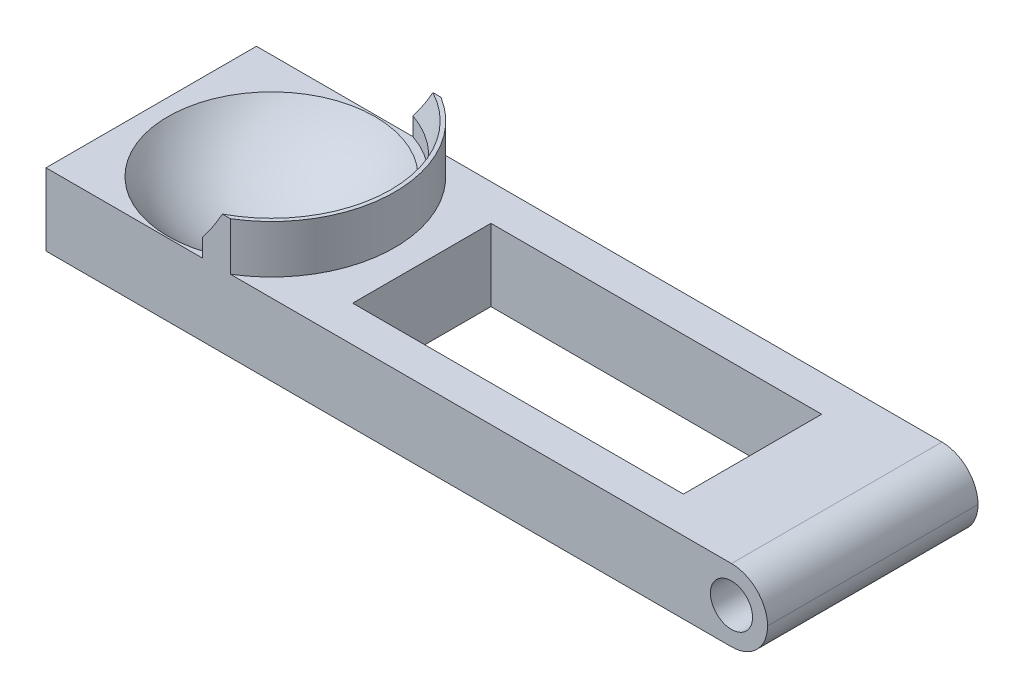
ISO-10303-21;
HEADER;
FILE_DESCRIPTION(('STEP AP214'),'2;1');
FILE_NAME('part.step','',(''),(''),'','','');
FILE_SCHEMA(('AUTOMOTIVE_DESIGN { 1 0 10303 214 1 1 1 1 }'));
ENDSEC;
DATA;
#1=APPLICATION_CONTEXT('core data for automotive mechanical design processes');
#2=APPLICATION_PROTOCOL_DEFINITION('international standard','automotive_design',2000,#1);
#3=PRODUCT_CONTEXT('',#1,'mechanical');
#4=PRODUCT('Part','Part','',(#3));
#5=PRODUCT_RELATED_PRODUCT_CATEGORY('part','',(#4));
#6=PRODUCT_DEFINITION_FORMATION('','',#4);
#7=PRODUCT_DEFINITION_CONTEXT('part definition',#1,'design');
#8=PRODUCT_DEFINITION('design','',#6,#7);
#9=PRODUCT_DEFINITION_SHAPE('','',#8);
#10=(LENGTH_UNIT() NAMED_UNIT(*) SI_UNIT(.MILLI.,.METRE.));
#11=(NAMED_UNIT(*) PLANE_ANGLE_UNIT() SI_UNIT($,.RADIAN.));
#12=(NAMED_UNIT(*) SI_UNIT($,.STERADIAN.) SOLID_ANGLE_UNIT());
#13=UNCERTAINTY_MEASURE_WITH_UNIT(LENGTH_MEASURE(1.E-05),#10,'distance_accuracy_value','');
#14=(GEOMETRIC_REPRESENTATION_CONTEXT(3) GLOBAL_UNCERTAINTY_ASSIGNED_CONTEXT((#13)) GLOBAL_UNIT_ASSIGNED_CONTEXT((#10,
#11,#12)) REPRESENTATION_CONTEXT('',''));
#15=CARTESIAN_POINT('',(0.,0.,0.));
#16=DIRECTION('',(0.,0.,1.));
#17=DIRECTION('',(1.,0.,0.));
#18=AXIS2_PLACEMENT_3D('',#15,#16,#17);
#19=CARTESIAN_POINT('',(0.,6.,0.));
#20=DIRECTION('',(0.,1.,0.));
#21=DIRECTION('',(0.,0.,1.));
#22=AXIS2_PLACEMENT_3D('',#19,#20,#21);
#23=PLANE('',#22);
#24=CARTESIAN_POINT('',(-40.,6.,0.));
#25=DIRECTION('',(0.,1.,0.));
#26=DIRECTION('',(0.,0.,1.));
#27=AXIS2_PLACEMENT_3D('',#24,#25,#26);
#28=CIRCLE('',#27,17.2336879396141);
#29=CARTESIAN_POINT('',(-40.,6.,17.2336879396141));
#30=VERTEX_POINT('',#29);
#31=EDGE_CURVE('E261',#30,#30,#28,.F.);
#32=ORIENTED_EDGE('',*,*,#31,.T.);
#33=EDGE_LOOP('',(#32));
#34=FACE_BOUND('',#33,.T.);
#35=DIRECTION('',(1.,0.,0.));
#36=VECTOR('',#35,1.);
#37=CARTESIAN_POINT('',(-60.,6.,17.5));
#38=LINE('',#37,#36);
#39=CARTESIAN_POINT('',(-60.,6.,17.5));
#40=VERTEX_POINT('',#39);
#41=CARTESIAN_POINT('',(-34.,6.,17.5));
#42=VERTEX_POINT('',#41);
#43=EDGE_CURVE('E269',#40,#42,#38,.T.);
#44=ORIENTED_EDGE('',*,*,#43,.T.);
#45=CARTESIAN_POINT('',(-40.,6.,0.));
#46=DIRECTION('',(0.,-1.,0.));
#47=DIRECTION('',(0.,0.,1.));
#48=AXIS2_PLACEMENT_3D('',#45,#46,#47);
#49=CIRCLE('',#48,18.5);
#50=CARTESIAN_POINT('',(-34.,6.,-17.5));
#51=VERTEX_POINT('',#50);
#52=EDGE_CURVE('E181',#51,#42,#49,.T.);
#53=ORIENTED_EDGE('',*,*,#52,.F.);
#54=DIRECTION('',(-1.,0.,0.));
#55=VECTOR('',#54,1.);
#56=CARTESIAN_POINT('',(-60.,6.,-17.5));
#57=LINE('',#56,#55);
#58=CARTESIAN_POINT('',(-60.,6.,-17.5));
#59=VERTEX_POINT('',#58);
#60=EDGE_CURVE('E266',#51,#59,#57,.T.);
#61=ORIENTED_EDGE('',*,*,#60,.T.);
#62=DIRECTION('',(0.,0.,1.));
#63=VECTOR('',#62,1.);
#64=CARTESIAN_POINT('',(-60.,6.,-17.5));
#65=LINE('',#64,#63);
#66=EDGE_CURVE('E265',#59,#40,#65,.T.);
#67=ORIENTED_EDGE('',*,*,#66,.T.);
#68=EDGE_LOOP('',(#44,#53,#61,#67));
#69=FACE_BOUND('',#68,.T.);
#70=ADVANCED_FACE('F41',(#34,#69),#23,.T.);
#71=DIRECTION('',(0.,0.,1.));
#72=VECTOR('',#71,1.);
#73=CARTESIAN_POINT('',(-15.,6.,-11.5));
#74=LINE('',#73,#72);
#75=CARTESIAN_POINT('',(-15.,6.,-11.5));
#76=VERTEX_POINT('',#75);
#77=CARTESIAN_POINT('',(-15.,6.,11.5));
#78=VERTEX_POINT('',#77);
#79=EDGE_CURVE('E193',#76,#78,#74,.T.);
#80=ORIENTED_EDGE('',*,*,#79,.F.);
#81=DIRECTION('',(-1.,0.,0.));
#82=VECTOR('',#81,1.);
#83=CARTESIAN_POINT('',(-15.,6.,-11.5));
#84=LINE('',#83,#82);
#85=CARTESIAN_POINT('',(40.,6.,-11.5));
#86=VERTEX_POINT('',#85);
#87=EDGE_CURVE('E199',#86,#76,#84,.T.);
#88=ORIENTED_EDGE('',*,*,#87,.F.);
#89=DIRECTION('',(0.,0.,-1.));
#90=VECTOR('',#89,1.);
#91=CARTESIAN_POINT('',(40.,6.,-11.5));
#92=LINE('',#91,#90);
#93=CARTESIAN_POINT('',(40.,6.,11.5));
#94=VERTEX_POINT('',#93);
#95=EDGE_CURVE('E218',#94,#86,#92,.T.);
#96=ORIENTED_EDGE('',*,*,#95,.F.);
#97=DIRECTION('',(1.,0.,0.));
#98=VECTOR('',#97,1.);
#99=CARTESIAN_POINT('',(-15.,6.,11.5));
#100=LINE('',#99,#98);
#101=EDGE_CURVE('E214',#78,#94,#100,.T.);
#102=ORIENTED_EDGE('',*,*,#101,.F.);
#103=EDGE_LOOP('',(#80,#88,#96,#102));
#104=FACE_BOUND('',#103,.T.);
#105=CARTESIAN_POINT('',(54.,6.,-17.5));
#106=VERTEX_POINT('',#105);
#107=CARTESIAN_POINT('',(-29.3229217479687,6.,-17.5));
#108=VERTEX_POINT('',#107);
#109=EDGE_CURVE('E262',#106,#108,#57,.T.);
#110=ORIENTED_EDGE('',*,*,#109,.T.);
#111=CARTESIAN_POINT('',(-40.,6.,0.));
#112=DIRECTION('',(0.,1.,0.));
#113=DIRECTION('',(0.,0.,1.));
#114=AXIS2_PLACEMENT_3D('',#111,#112,#113);
#115=CIRCLE('',#114,20.5);
#116=CARTESIAN_POINT('',(-29.3229217479687,6.,17.5));
#117=VERTEX_POINT('',#116);
#118=EDGE_CURVE('E157',#117,#108,#115,.T.);
#119=ORIENTED_EDGE('',*,*,#118,.F.);
#120=CARTESIAN_POINT('',(54.,6.,17.5));
#121=VERTEX_POINT('',#120);
#122=EDGE_CURVE('E164',#117,#121,#38,.T.);
#123=ORIENTED_EDGE('',*,*,#122,.T.);
#124=DIRECTION('',(0.,0.,-1.));
#125=VECTOR('',#124,1.);
#126=CARTESIAN_POINT('',(54.,6.,-17.5));
#127=LINE('',#126,#125);
#128=EDGE_CURVE('E292',#121,#106,#127,.T.);
#129=ORIENTED_EDGE('',*,*,#128,.T.);
#130=EDGE_LOOP('',(#110,#119,#123,#129));
#131=FACE_BOUND('',#130,.T.);
#132=ADVANCED_FACE('F339',(#104,#131),#23,.T.);
#133=CARTESIAN_POINT('',(-60.,6.,-17.5));
#134=DIRECTION('',(0.,0.,1.));
#135=DIRECTION('',(1.,0.,0.));
#136=AXIS2_PLACEMENT_3D('',#133,#134,#135);
#137=PLANE('',#136);
#138=CARTESIAN_POINT('',(54.,0.,-17.5));
#139=DIRECTION('',(0.,0.,1.));
#140=DIRECTION('',(1.,0.,0.));
#141=AXIS2_PLACEMENT_3D('',#138,#139,#140);
#142=CIRCLE('',#141,3.49999999999999);
#143=CARTESIAN_POINT('',(57.5,0.,-17.5));
#144=VERTEX_POINT('',#143);
#145=EDGE_CURVE('E257',#144,#144,#142,.T.);
#146=ORIENTED_EDGE('',*,*,#145,.T.);
#147=EDGE_LOOP('',(#146));
#148=FACE_BOUND('',#147,.T.);
#149=DIRECTION('',(0.,-1.,0.));
#150=VECTOR('',#149,1.);
#151=CARTESIAN_POINT('',(-34.,14.,-17.5));
#152=LINE('',#151,#150);
#153=CARTESIAN_POINT('',(-34.,8.9999999999998,-17.5));
#154=VERTEX_POINT('',#153);
#155=EDGE_CURVE('E178',#154,#51,#152,.T.);
#156=ORIENTED_EDGE('',*,*,#155,.F.);
#157=CARTESIAN_POINT('',(-34.,8.9999999999998,-17.5));
#158=CARTESIAN_POINT('',(-33.839945813921,9.19379162147937,-17.5));
#159=CARTESIAN_POINT('',(-33.6832597545491,9.39031813066395,-17.5));
#160=CARTESIAN_POINT('',(-33.375965891554,9.78799904200103,-17.5));
#161=CARTESIAN_POINT('',(-33.2253566520652,9.98915233306445,-17.5));
#162=CARTESIAN_POINT('',(-32.9297425304379,10.3949815209771,-17.5));
#163=CARTESIAN_POINT('',(-32.7847282801367,10.5996506190985,-17.5));
#164=CARTESIAN_POINT('',(-32.4994602314663,11.0122906147006,-17.5));
#165=CARTESIAN_POINT('',(-32.3592067428698,11.2202617257487,-17.5));
#166=CARTESIAN_POINT('',(-31.9449508238071,11.8482158349723,-17.5));
#167=CARTESIAN_POINT('',(-31.6773247984188,12.2724176608303,-17.5));
#168=CARTESIAN_POINT('',(-31.286102984043,12.9153929206351,-17.5));
#169=CARTESIAN_POINT('',(-31.1572850971386,13.1310310144792,-17.5));
#170=CARTESIAN_POINT('',(-30.9028469630048,13.5641710952025,-17.5));
#171=CARTESIAN_POINT('',(-30.7772265452698,13.7816729818645,-17.5));
#172=CARTESIAN_POINT('',(-30.6530475638917,14.,-17.5));
#173=B_SPLINE_CURVE_WITH_KNOTS('',3,(#157,#158,#159,#160,#161,#162,#163,#164,#165,#166,#167,
#168,#169,#170,#171,#172),.UNSPECIFIED.,.F.,.F.,(4,2,2,2,2,2,2,4),(0.,0.753934324298083,
1.50768944879851,2.26012226827586,3.01260395345633,4.51690974592432,5.27044665794318,
6.02394330294391),.UNSPECIFIED.);
#174=CARTESIAN_POINT('',(-30.6530475638917,14.,-17.5));
#175=VERTEX_POINT('',#174);
#176=EDGE_CURVE('E11',#154,#175,#173,.T.);
#177=ORIENTED_EDGE('',*,*,#176,.T.);
#178=DIRECTION('',(-1.,0.,0.));
#179=VECTOR('',#178,1.);
#180=CARTESIAN_POINT('',(-34.,14.,-17.5));
#181=LINE('',#180,#179);
#182=CARTESIAN_POINT('',(-29.3229217479687,14.,-17.5));
#183=VERTEX_POINT('',#182);
#184=EDGE_CURVE('E175',#183,#175,#181,.T.);
#185=ORIENTED_EDGE('',*,*,#184,.F.);
#186=DIRECTION('',(0.,-1.,0.));
#187=VECTOR('',#186,1.);
#188=CARTESIAN_POINT('',(-29.3229217479687,14.,-17.5));
#189=LINE('',#188,#187);
#190=EDGE_CURVE('E169',#183,#108,#189,.T.);
#191=ORIENTED_EDGE('',*,*,#190,.T.);
#192=ORIENTED_EDGE('',*,*,#109,.F.);
#193=CARTESIAN_POINT('',(54.,0.,-17.5));
#194=DIRECTION('',(0.,0.,1.));
#195=DIRECTION('',(1.,0.,0.));
#196=AXIS2_PLACEMENT_3D('',#193,#194,#195);
#197=CIRCLE('',#196,6.);
#198=CARTESIAN_POINT('',(60.,0.,-17.5));
#199=VERTEX_POINT('',#198);
#200=EDGE_CURVE('E299',#106,#199,#197,.F.);
#201=ORIENTED_EDGE('',*,*,#200,.T.);
#202=CARTESIAN_POINT('',(54.,0.,-17.5));
#203=DIRECTION('',(0.,0.,1.));
#204=DIRECTION('',(1.,0.,0.));
#205=AXIS2_PLACEMENT_3D('',#202,#203,#204);
#206=CIRCLE('',#205,6.);
#207=CARTESIAN_POINT('',(54.,-6.,-17.5));
#208=VERTEX_POINT('',#207);
#209=EDGE_CURVE('E296',#199,#208,#206,.F.);
#210=ORIENTED_EDGE('',*,*,#209,.T.);
#211=DIRECTION('',(-1.,0.,0.));
#212=VECTOR('',#211,1.);
#213=CARTESIAN_POINT('',(-60.,-6.,-17.5));
#214=LINE('',#213,#212);
#215=CARTESIAN_POINT('',(-60.,-6.,-17.5));
#216=VERTEX_POINT('',#215);
#217=EDGE_CURVE('E274',#208,#216,#214,.T.);
#218=ORIENTED_EDGE('',*,*,#217,.T.);
#219=DIRECTION('',(0.,-1.,0.));
#220=VECTOR('',#219,1.);
#221=CARTESIAN_POINT('',(-60.,6.,-17.5));
#222=LINE('',#221,#220);
#223=EDGE_CURVE('E288',#59,#216,#222,.T.);
#224=ORIENTED_EDGE('',*,*,#223,.F.);
#225=ORIENTED_EDGE('',*,*,#60,.F.);
#226=EDGE_LOOP('',(#156,#177,#185,#191,#192,#201,#210,#218,#224,#225));
#227=FACE_BOUND('',#226,.T.);
#228=ADVANCED_FACE('F334',(#148,#227),#137,.F.);
#229=CARTESIAN_POINT('',(-60.,6.,-17.5));
#230=DIRECTION('',(1.,0.,0.));
#231=DIRECTION('',(0.,0.,-1.));
#232=AXIS2_PLACEMENT_3D('',#229,#230,#231);
#233=PLANE('',#232);
#234=DIRECTION('',(0.,0.,1.));
#235=VECTOR('',#234,1.);
#236=CARTESIAN_POINT('',(-60.,-6.,-17.5));
#237=LINE('',#236,#235);
#238=CARTESIAN_POINT('',(-60.,-6.,17.5));
#239=VERTEX_POINT('',#238);
#240=EDGE_CURVE('E277',#216,#239,#237,.T.);
#241=ORIENTED_EDGE('',*,*,#240,.T.);
#242=DIRECTION('',(0.,-1.,0.));
#243=VECTOR('',#242,1.);
#244=CARTESIAN_POINT('',(-60.,6.,17.5));
#245=LINE('',#244,#243);
#246=EDGE_CURVE('E273',#40,#239,#245,.T.);
#247=ORIENTED_EDGE('',*,*,#246,.F.);
#248=ORIENTED_EDGE('',*,*,#66,.F.);
#249=ORIENTED_EDGE('',*,*,#223,.T.);
#250=EDGE_LOOP('',(#241,#247,#248,#249));
#251=FACE_BOUND('',#250,.T.);
#252=ADVANCED_FACE('F330',(#251),#233,.F.);
#253=CARTESIAN_POINT('',(-60.,6.,17.5));
#254=DIRECTION('',(0.,0.,-1.));
#255=DIRECTION('',(-1.,0.,0.));
#256=AXIS2_PLACEMENT_3D('',#253,#254,#255);
#257=PLANE('',#256);
#258=CARTESIAN_POINT('',(54.,0.,17.5));
#259=DIRECTION('',(0.,0.,1.));
#260=DIRECTION('',(1.,0.,0.));
#261=AXIS2_PLACEMENT_3D('',#258,#259,#260);
#262=CIRCLE('',#261,3.5);
#263=CARTESIAN_POINT('',(57.5,0.,17.5));
#264=VERTEX_POINT('',#263);
#265=EDGE_CURVE('E242',#264,#264,#262,.T.);
#266=ORIENTED_EDGE('',*,*,#265,.F.);
#267=EDGE_LOOP('',(#266));
#268=FACE_BOUND('',#267,.T.);
#269=DIRECTION('',(1.,0.,0.));
#270=VECTOR('',#269,1.);
#271=CARTESIAN_POINT('',(-34.,14.,17.5));
#272=LINE('',#271,#270);
#273=CARTESIAN_POINT('',(-30.6530475638917,14.,17.5));
#274=VERTEX_POINT('',#273);
#275=CARTESIAN_POINT('',(-29.3229217479687,14.,17.5));
#276=VERTEX_POINT('',#275);
#277=EDGE_CURVE('E147',#274,#276,#272,.T.);
#278=ORIENTED_EDGE('',*,*,#277,.F.);
#279=CARTESIAN_POINT('',(-30.6530475638917,14.,17.5));
#280=CARTESIAN_POINT('',(-30.7772265452698,13.7816729818645,17.5));
#281=CARTESIAN_POINT('',(-30.9028469630048,13.5641710952025,17.5));
#282=CARTESIAN_POINT('',(-31.1572850971386,13.1310310144792,17.5));
#283=CARTESIAN_POINT('',(-31.286102984043,12.9153929206351,17.5));
#284=CARTESIAN_POINT('',(-31.6773247984187,12.2724176608303,17.5));
#285=CARTESIAN_POINT('',(-31.9449508238071,11.8482158349723,17.5));
#286=CARTESIAN_POINT('',(-32.3592067428698,11.2202617257487,17.5));
#287=CARTESIAN_POINT('',(-32.4994602314664,11.0122906147006,17.5));
#288=CARTESIAN_POINT('',(-32.7847282801367,10.5996506190985,17.5));
#289=CARTESIAN_POINT('',(-32.9297425304379,10.3949815209771,17.5));
#290=CARTESIAN_POINT('',(-33.2253566520652,9.98915233306448,17.5));
#291=CARTESIAN_POINT('',(-33.375965891554,9.78799904200108,17.5));
#292=CARTESIAN_POINT('',(-33.683259754549,9.39031813066397,17.5));
#293=CARTESIAN_POINT('',(-33.8399458139209,9.19379162147934,17.5));
#294=CARTESIAN_POINT('',(-33.9999999999997,8.99999999999963,17.5));
#295=B_SPLINE_CURVE_WITH_KNOTS('',3,(#279,#280,#281,#282,#283,#284,#285,#286,#287,#288,#289,
#290,#291,#292,#293,#294),.UNSPECIFIED.,.F.,.F.,(4,2,2,2,2,2,2,4),(0.,0.753496645000725,
1.50703355701958,3.01133934948757,3.76382103466804,4.51625385414538,5.27000897864579,
6.02394330294385),.UNSPECIFIED.);
#296=CARTESIAN_POINT('',(-34.,8.9999999999998,17.5));
#297=VERTEX_POINT('',#296);
#298=EDGE_CURVE('E71',#274,#297,#295,.T.);
#299=ORIENTED_EDGE('',*,*,#298,.T.);
#300=DIRECTION('',(0.,-1.,0.));
#301=VECTOR('',#300,1.);
#302=CARTESIAN_POINT('',(-34.,14.,17.5));
#303=LINE('',#302,#301);
#304=EDGE_CURVE('E168',#297,#42,#303,.T.);
#305=ORIENTED_EDGE('',*,*,#304,.T.);
#306=ORIENTED_EDGE('',*,*,#43,.F.);
#307=ORIENTED_EDGE('',*,*,#246,.T.);
#308=DIRECTION('',(1.,0.,0.));
#309=VECTOR('',#308,1.);
#310=CARTESIAN_POINT('',(-60.,-6.,17.5));
#311=LINE('',#310,#309);
#312=CARTESIAN_POINT('',(54.,-6.,17.5));
#313=VERTEX_POINT('',#312);
#314=EDGE_CURVE('E281',#239,#313,#311,.T.);
#315=ORIENTED_EDGE('',*,*,#314,.T.);
#316=CARTESIAN_POINT('',(54.,0.,17.5));
#317=DIRECTION('',(0.,0.,-1.));
#318=DIRECTION('',(-1.,0.,0.));
#319=AXIS2_PLACEMENT_3D('',#316,#317,#318);
#320=CIRCLE('',#319,6.);
#321=CARTESIAN_POINT('',(60.,0.,17.5));
#322=VERTEX_POINT('',#321);
#323=EDGE_CURVE('E302',#313,#322,#320,.F.);
#324=ORIENTED_EDGE('',*,*,#323,.T.);
#325=CARTESIAN_POINT('',(54.,0.,17.5));
#326=DIRECTION('',(0.,0.,-1.));
#327=DIRECTION('',(-1.,0.,0.));
#328=AXIS2_PLACEMENT_3D('',#325,#326,#327);
#329=CIRCLE('',#328,6.);
#330=EDGE_CURVE('E305',#322,#121,#329,.F.);
#331=ORIENTED_EDGE('',*,*,#330,.T.);
#332=ORIENTED_EDGE('',*,*,#122,.F.);
#333=DIRECTION('',(0.,-1.,0.));
#334=VECTOR('',#333,1.);
#335=CARTESIAN_POINT('',(-29.3229217479687,14.,17.5));
#336=LINE('',#335,#334);
#337=EDGE_CURVE('E161',#276,#117,#336,.T.);
#338=ORIENTED_EDGE('',*,*,#337,.F.);
#339=EDGE_LOOP('',(#278,#299,#305,#306,#307,#315,#324,#331,#332,#338));
#340=FACE_BOUND('',#339,.T.);
#341=ADVANCED_FACE('F162',(#268,#340),#257,.F.);
#342=CARTESIAN_POINT('',(0.,-6.,0.));
#343=DIRECTION('',(0.,1.,0.));
#344=DIRECTION('',(0.,0.,1.));
#345=AXIS2_PLACEMENT_3D('',#342,#343,#344);
#346=PLANE('',#345);
#347=DIRECTION('',(-1.,0.,0.));
#348=VECTOR('',#347,1.);
#349=CARTESIAN_POINT('',(-15.,-6.,-11.5));
#350=LINE('',#349,#348);
#351=CARTESIAN_POINT('',(40.,-6.,-11.5));
#352=VERTEX_POINT('',#351);
#353=CARTESIAN_POINT('',(-15.,-6.,-11.5));
#354=VERTEX_POINT('',#353);
#355=EDGE_CURVE('E207',#352,#354,#350,.T.);
#356=ORIENTED_EDGE('',*,*,#355,.T.);
#357=DIRECTION('',(0.,0.,1.));
#358=VECTOR('',#357,1.);
#359=CARTESIAN_POINT('',(-15.,-6.,-11.5));
#360=LINE('',#359,#358);
#361=CARTESIAN_POINT('',(-15.,-6.,11.5));
#362=VERTEX_POINT('',#361);
#363=EDGE_CURVE('E194',#354,#362,#360,.T.);
#364=ORIENTED_EDGE('',*,*,#363,.T.);
#365=DIRECTION('',(1.,0.,0.));
#366=VECTOR('',#365,1.);
#367=CARTESIAN_POINT('',(-15.,-6.,11.5));
#368=LINE('',#367,#366);
#369=CARTESIAN_POINT('',(40.,-6.,11.5));
#370=VERTEX_POINT('',#369);
#371=EDGE_CURVE('E198',#362,#370,#368,.T.);
#372=ORIENTED_EDGE('',*,*,#371,.T.);
#373=DIRECTION('',(0.,0.,-1.));
#374=VECTOR('',#373,1.);
#375=CARTESIAN_POINT('',(40.,-6.,-11.5));
#376=LINE('',#375,#374);
#377=EDGE_CURVE('E203',#370,#352,#376,.T.);
#378=ORIENTED_EDGE('',*,*,#377,.T.);
#379=EDGE_LOOP('',(#356,#364,#372,#378));
#380=FACE_BOUND('',#379,.T.);
#381=CARTESIAN_POINT('',(-45.5,-6.,10.));
#382=DIRECTION('',(0.,-1.,0.));
#383=DIRECTION('',(0.,0.,-1.));
#384=AXIS2_PLACEMENT_3D('',#381,#382,#383);
#385=CIRCLE('',#384,5.25);
#386=CARTESIAN_POINT('',(-45.5,-6.,4.75000000000001));
#387=VERTEX_POINT('',#386);
#388=EDGE_CURVE('E243',#387,#387,#385,.T.);
#389=ORIENTED_EDGE('',*,*,#388,.F.);
#390=EDGE_LOOP('',(#389));
#391=FACE_BOUND('',#390,.T.);
#392=CARTESIAN_POINT('',(-45.5,-6.,-10.));
#393=DIRECTION('',(0.,-1.,0.));
#394=DIRECTION('',(0.,0.,1.));
#395=AXIS2_PLACEMENT_3D('',#392,#393,#394);
#396=CIRCLE('',#395,5.25);
#397=CARTESIAN_POINT('',(-45.5,-6.,-4.75000000000001));
#398=VERTEX_POINT('',#397);
#399=EDGE_CURVE('E228',#398,#398,#396,.T.);
#400=ORIENTED_EDGE('',*,*,#399,.F.);
#401=EDGE_LOOP('',(#400));
#402=FACE_BOUND('',#401,.T.);
#403=ORIENTED_EDGE('',*,*,#217,.F.);
#404=DIRECTION('',(0.,0.,-1.));
#405=VECTOR('',#404,1.);
#406=CARTESIAN_POINT('',(54.,-6.,0.));
#407=LINE('',#406,#405);
#408=EDGE_CURVE('E308',#208,#313,#407,.F.);
#409=ORIENTED_EDGE('',*,*,#408,.T.);
#410=ORIENTED_EDGE('',*,*,#314,.F.);
#411=ORIENTED_EDGE('',*,*,#240,.F.);
#412=EDGE_LOOP('',(#403,#409,#410,#411));
#413=FACE_BOUND('',#412,.T.);
#414=ADVANCED_FACE('F329',(#380,#391,#402,#413),#346,.F.);
#415=CARTESIAN_POINT('',(54.,0.,-17.5));
#416=DIRECTION('',(0.,0.,-1.));
#417=DIRECTION('',(-1.,0.,0.));
#418=AXIS2_PLACEMENT_3D('',#415,#416,#417);
#419=CYLINDRICAL_SURFACE('',#418,6.);
#420=DIRECTION('',(0.,0.,-1.));
#421=VECTOR('',#420,1.);
#422=CARTESIAN_POINT('',(60.,0.,-17.5));
#423=LINE('',#422,#421);
#424=EDGE_CURVE('E278',#322,#199,#423,.T.);
#425=ORIENTED_EDGE('',*,*,#424,.F.);
#426=ORIENTED_EDGE('',*,*,#323,.F.);
#427=ORIENTED_EDGE('',*,*,#408,.F.);
#428=ORIENTED_EDGE('',*,*,#209,.F.);
#429=EDGE_LOOP('',(#425,#426,#427,#428));
#430=FACE_BOUND('',#429,.T.);
#431=ADVANCED_FACE('F344',(#430),#419,.T.);
#432=CARTESIAN_POINT('',(54.,0.,0.));
#433=DIRECTION('',(0.,0.,1.));
#434=DIRECTION('',(1.,0.,0.));
#435=AXIS2_PLACEMENT_3D('',#432,#433,#434);
#436=CYLINDRICAL_SURFACE('',#435,6.);
#437=ORIENTED_EDGE('',*,*,#330,.F.);
#438=ORIENTED_EDGE('',*,*,#424,.T.);
#439=ORIENTED_EDGE('',*,*,#200,.F.);
#440=ORIENTED_EDGE('',*,*,#128,.F.);
#441=EDGE_LOOP('',(#437,#438,#439,#440));
#442=FACE_BOUND('',#441,.T.);
#443=ADVANCED_FACE('F341',(#442),#436,.T.);
#444=CARTESIAN_POINT('',(-40.,18.,0.));
#445=DIRECTION('',(-1.,0.,0.));
#446=DIRECTION('',(0.,1.,0.));
#447=AXIS2_PLACEMENT_3D('',#444,#445,#446);
#448=SPHERICAL_SURFACE('',#447,21.);
#449=CARTESIAN_POINT('',(-40.,18.,0.));
#450=DIRECTION('',(0.,1.,0.));
#451=DIRECTION('',(0.,0.,1.));
#452=AXIS2_PLACEMENT_3D('',#449,#450,#451);
#453=SPHERICAL_SURFACE('',#452,21.);
#454=ORIENTED_EDGE('',*,*,#31,.F.);
#455=EDGE_LOOP('',(#454));
#456=FACE_BOUND('',#455,.T.);
#457=ADVANCED_FACE('F343',(#456),#453,.F.);
#458=CARTESIAN_POINT('',(54.,0.,17.5));
#459=DIRECTION('',(0.,0.,1.));
#460=DIRECTION('',(1.,0.,0.));
#461=AXIS2_PLACEMENT_3D('',#458,#459,#460);
#462=CYLINDRICAL_SURFACE('',#461,3.49999999999999);
#463=ORIENTED_EDGE('',*,*,#145,.F.);
#464=EDGE_LOOP('',(#463));
#465=FACE_BOUND('',#464,.T.);
#466=ORIENTED_EDGE('',*,*,#265,.T.);
#467=EDGE_LOOP('',(#466));
#468=FACE_BOUND('',#467,.T.);
#469=ADVANCED_FACE('F363',(#465,#468),#462,.F.);
#470=CARTESIAN_POINT('',(-45.5,-4.5,-10.));
#471=DIRECTION('',(0.,-1.,0.));
#472=DIRECTION('',(0.,0.,-1.));
#473=AXIS2_PLACEMENT_3D('',#470,#471,#472);
#474=CYLINDRICAL_SURFACE('',#473,5.25);
#475=CARTESIAN_POINT('',(-45.5,-4.5,-10.));
#476=DIRECTION('',(0.,-1.,0.));
#477=DIRECTION('',(0.,0.,1.));
#478=AXIS2_PLACEMENT_3D('',#475,#476,#477);
#479=CIRCLE('',#478,5.25);
#480=CARTESIAN_POINT('',(-45.5,-4.5,-4.75000000000001));
#481=VERTEX_POINT('',#480);
#482=EDGE_CURVE('E247',#481,#481,#479,.T.);
#483=ORIENTED_EDGE('',*,*,#482,.F.);
#484=EDGE_LOOP('',(#483));
#485=FACE_BOUND('',#484,.T.);
#486=ORIENTED_EDGE('',*,*,#399,.T.);
#487=EDGE_LOOP('',(#486));
#488=FACE_BOUND('',#487,.T.);
#489=ADVANCED_FACE('F367',(#485,#488),#474,.F.);
#490=CARTESIAN_POINT('',(-45.5,-4.5,-10.));
#491=DIRECTION('',(0.,1.,0.));
#492=DIRECTION('',(0.,0.,1.));
#493=AXIS2_PLACEMENT_3D('',#490,#491,#492);
#494=PLANE('',#493);
#495=ORIENTED_EDGE('',*,*,#482,.T.);
#496=EDGE_LOOP('',(#495));
#497=FACE_BOUND('',#496,.T.);
#498=ADVANCED_FACE('F371',(#497),#494,.F.);
#499=CARTESIAN_POINT('',(-45.5,-4.5,10.));
#500=DIRECTION('',(0.,-1.,0.));
#501=DIRECTION('',(0.,0.,-1.));
#502=AXIS2_PLACEMENT_3D('',#499,#500,#501);
#503=CYLINDRICAL_SURFACE('',#502,5.25);
#504=CARTESIAN_POINT('',(-45.5,-4.5,10.));
#505=DIRECTION('',(0.,-1.,0.));
#506=DIRECTION('',(0.,0.,-1.));
#507=AXIS2_PLACEMENT_3D('',#504,#505,#506);
#508=CIRCLE('',#507,5.25);
#509=CARTESIAN_POINT('',(-45.5,-4.5,4.75000000000001));
#510=VERTEX_POINT('',#509);
#511=EDGE_CURVE('E238',#510,#510,#508,.T.);
#512=ORIENTED_EDGE('',*,*,#511,.F.);
#513=EDGE_LOOP('',(#512));
#514=FACE_BOUND('',#513,.T.);
#515=ORIENTED_EDGE('',*,*,#388,.T.);
#516=EDGE_LOOP('',(#515));
#517=FACE_BOUND('',#516,.T.);
#518=ADVANCED_FACE('F375',(#514,#517),#503,.F.);
#519=CARTESIAN_POINT('',(-45.5,-4.5,10.));
#520=DIRECTION('',(0.,-1.,0.));
#521=DIRECTION('',(0.,0.,-1.));
#522=AXIS2_PLACEMENT_3D('',#519,#520,#521);
#523=PLANE('',#522);
#524=ORIENTED_EDGE('',*,*,#511,.T.);
#525=EDGE_LOOP('',(#524));
#526=FACE_BOUND('',#525,.T.);
#527=ADVANCED_FACE('F379',(#526),#523,.T.);
#528=CARTESIAN_POINT('',(-15.,-6.,-11.5));
#529=DIRECTION('',(-1.,0.,0.));
#530=DIRECTION('',(0.,0.,1.));
#531=AXIS2_PLACEMENT_3D('',#528,#529,#530);
#532=PLANE('',#531);
#533=ORIENTED_EDGE('',*,*,#79,.T.);
#534=DIRECTION('',(0.,1.,0.));
#535=VECTOR('',#534,1.);
#536=CARTESIAN_POINT('',(-15.,-6.,11.5));
#537=LINE('',#536,#535);
#538=EDGE_CURVE('E211',#362,#78,#537,.T.);
#539=ORIENTED_EDGE('',*,*,#538,.F.);
#540=ORIENTED_EDGE('',*,*,#363,.F.);
#541=DIRECTION('',(0.,1.,0.));
#542=VECTOR('',#541,1.);
#543=CARTESIAN_POINT('',(-15.,-6.,-11.5));
#544=LINE('',#543,#542);
#545=EDGE_CURVE('E225',#354,#76,#544,.T.);
#546=ORIENTED_EDGE('',*,*,#545,.T.);
#547=EDGE_LOOP('',(#533,#539,#540,#546));
#548=FACE_BOUND('',#547,.T.);
#549=ADVANCED_FACE('F383',(#548),#532,.F.);
#550=CARTESIAN_POINT('',(-15.,-6.,-11.5));
#551=DIRECTION('',(0.,0.,-1.));
#552=DIRECTION('',(-1.,0.,0.));
#553=AXIS2_PLACEMENT_3D('',#550,#551,#552);
#554=PLANE('',#553);
#555=ORIENTED_EDGE('',*,*,#87,.T.);
#556=ORIENTED_EDGE('',*,*,#545,.F.);
#557=ORIENTED_EDGE('',*,*,#355,.F.);
#558=DIRECTION('',(0.,1.,0.));
#559=VECTOR('',#558,1.);
#560=CARTESIAN_POINT('',(40.,-6.,-11.5));
#561=LINE('',#560,#559);
#562=EDGE_CURVE('E229',#352,#86,#561,.T.);
#563=ORIENTED_EDGE('',*,*,#562,.T.);
#564=EDGE_LOOP('',(#555,#556,#557,#563));
#565=FACE_BOUND('',#564,.T.);
#566=ADVANCED_FACE('F387',(#565),#554,.F.);
#567=CARTESIAN_POINT('',(40.,-6.,-11.5));
#568=DIRECTION('',(1.,0.,0.));
#569=DIRECTION('',(0.,0.,-1.));
#570=AXIS2_PLACEMENT_3D('',#567,#568,#569);
#571=PLANE('',#570);
#572=ORIENTED_EDGE('',*,*,#95,.T.);
#573=ORIENTED_EDGE('',*,*,#562,.F.);
#574=ORIENTED_EDGE('',*,*,#377,.F.);
#575=DIRECTION('',(0.,1.,0.));
#576=VECTOR('',#575,1.);
#577=CARTESIAN_POINT('',(40.,-6.,11.5));
#578=LINE('',#577,#576);
#579=EDGE_CURVE('E232',#370,#94,#578,.T.);
#580=ORIENTED_EDGE('',*,*,#579,.T.);
#581=EDGE_LOOP('',(#572,#573,#574,#580));
#582=FACE_BOUND('',#581,.T.);
#583=ADVANCED_FACE('F393',(#582),#571,.F.);
#584=CARTESIAN_POINT('',(-15.,-6.,11.5));
#585=DIRECTION('',(0.,0.,1.));
#586=DIRECTION('',(1.,0.,0.));
#587=AXIS2_PLACEMENT_3D('',#584,#585,#586);
#588=PLANE('',#587);
#589=ORIENTED_EDGE('',*,*,#101,.T.);
#590=ORIENTED_EDGE('',*,*,#579,.F.);
#591=ORIENTED_EDGE('',*,*,#371,.F.);
#592=ORIENTED_EDGE('',*,*,#538,.T.);
#593=EDGE_LOOP('',(#589,#590,#591,#592));
#594=FACE_BOUND('',#593,.T.);
#595=ADVANCED_FACE('F389',(#594),#588,.F.);
#596=CARTESIAN_POINT('',(-40.,14.,0.));
#597=DIRECTION('',(0.,-1.,0.));
#598=DIRECTION('',(0.,0.,-1.));
#599=AXIS2_PLACEMENT_3D('',#596,#597,#598);
#600=CYLINDRICAL_SURFACE('',#599,18.5);
#601=ORIENTED_EDGE('',*,*,#304,.F.);
#602=CARTESIAN_POINT('',(-40.,8.9999999999998,0.));
#603=DIRECTION('',(0.,1.,0.));
#604=DIRECTION('',(0.,0.,1.));
#605=AXIS2_PLACEMENT_3D('',#602,#603,#604);
#606=CIRCLE('',#605,18.5);
#607=EDGE_CURVE('E57',#297,#154,#606,.T.);
#608=ORIENTED_EDGE('',*,*,#607,.T.);
#609=ORIENTED_EDGE('',*,*,#155,.T.);
#610=ORIENTED_EDGE('',*,*,#52,.T.);
#611=EDGE_LOOP('',(#601,#608,#609,#610));
#612=FACE_BOUND('',#611,.T.);
#613=ADVANCED_FACE('F392',(#612),#600,.F.);
#614=CARTESIAN_POINT('',(-40.,14.,0.));
#615=DIRECTION('',(0.,-1.,0.));
#616=DIRECTION('',(0.,0.,-1.));
#617=AXIS2_PLACEMENT_3D('',#614,#615,#616);
#618=CYLINDRICAL_SURFACE('',#617,20.5);
#619=ORIENTED_EDGE('',*,*,#118,.T.);
#620=ORIENTED_EDGE('',*,*,#190,.F.);
#621=CARTESIAN_POINT('',(-40.,14.,0.));
#622=DIRECTION('',(0.,1.,0.));
#623=DIRECTION('',(0.,0.,1.));
#624=AXIS2_PLACEMENT_3D('',#621,#622,#623);
#625=CIRCLE('',#624,20.5);
#626=EDGE_CURVE('E152',#276,#183,#625,.T.);
#627=ORIENTED_EDGE('',*,*,#626,.F.);
#628=ORIENTED_EDGE('',*,*,#337,.T.);
#629=EDGE_LOOP('',(#619,#620,#627,#628));
#630=FACE_BOUND('',#629,.T.);
#631=ADVANCED_FACE('F171',(#630),#618,.T.);
#632=CARTESIAN_POINT('',(-40.,14.,0.));
#633=DIRECTION('',(0.,1.,0.));
#634=DIRECTION('',(0.,0.,1.));
#635=AXIS2_PLACEMENT_3D('',#632,#633,#634);
#636=PLANE('',#635);
#637=ORIENTED_EDGE('',*,*,#184,.T.);
#638=CARTESIAN_POINT('',(-40.,14.,0.));
#639=DIRECTION('',(0.,1.,0.));
#640=DIRECTION('',(0.,0.,1.));
#641=AXIS2_PLACEMENT_3D('',#638,#639,#640);
#642=CIRCLE('',#641,19.8397459621556);
#643=EDGE_CURVE('E155',#175,#274,#642,.F.);
#644=ORIENTED_EDGE('',*,*,#643,.T.);
#645=ORIENTED_EDGE('',*,*,#277,.T.);
#646=ORIENTED_EDGE('',*,*,#626,.T.);
#647=EDGE_LOOP('',(#637,#644,#645,#646));
#648=FACE_BOUND('',#647,.T.);
#649=ADVANCED_FACE('F150',(#648),#636,.T.);
#650=CARTESIAN_POINT('',(-40.,14.,0.));
#651=DIRECTION('',(0.,1.,0.));
#652=DIRECTION('',(0.,0.,1.));
#653=AXIS2_PLACEMENT_3D('',#650,#651,#652);
#654=CONICAL_SURFACE('',#653,19.8397459621556,0.261799387799146);
#655=ORIENTED_EDGE('',*,*,#176,.F.);
#656=ORIENTED_EDGE('',*,*,#607,.F.);
#657=ORIENTED_EDGE('',*,*,#298,.F.);
#658=ORIENTED_EDGE('',*,*,#643,.F.);
#659=EDGE_LOOP('',(#655,#656,#657,#658));
#660=FACE_BOUND('',#659,.T.);
#661=ADVANCED_FACE('F44',(#660),#654,.F.);
#662=CLOSED_SHELL('',(#70,#132,#228,#252,#341,#414,#431,#443,#457,#469,#489,#498,#518,#527,#549,
#566,#583,#595,#613,#631,#649,#661));
#663=MANIFOLD_SOLID_BREP('B2',#662);
#664=ADVANCED_BREP_SHAPE_REPRESENTATION('',(#18,#663),#14);
#665=SHAPE_DEFINITION_REPRESENTATION(#9,#664);
ENDSEC;
END-ISO-10303-21;
